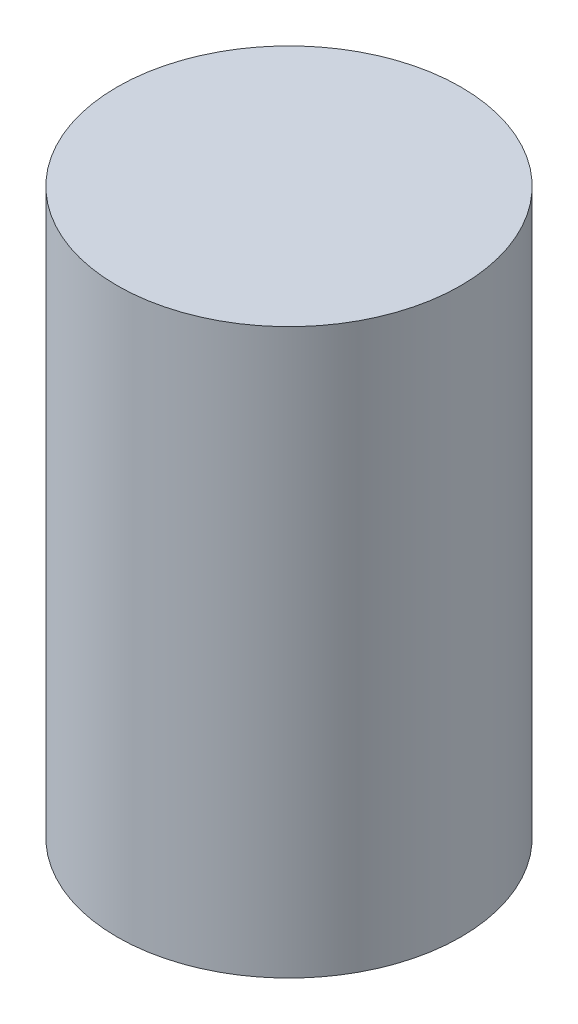
ISO-10303-21;
HEADER;
FILE_DESCRIPTION(('STEP AP214'),'2;1');
FILE_NAME('part.step','',(''),(''),'','','');
FILE_SCHEMA(('AUTOMOTIVE_DESIGN { 1 0 10303 214 1 1 1 1 }'));
ENDSEC;
DATA;
#1=APPLICATION_CONTEXT('core data for automotive mechanical design processes');
#2=APPLICATION_PROTOCOL_DEFINITION('international standard','automotive_design',2000,#1);
#3=PRODUCT_CONTEXT('',#1,'mechanical');
#4=PRODUCT('Part','Part','',(#3));
#5=PRODUCT_RELATED_PRODUCT_CATEGORY('part','',(#4));
#6=PRODUCT_DEFINITION_FORMATION('','',#4);
#7=PRODUCT_DEFINITION_CONTEXT('part definition',#1,'design');
#8=PRODUCT_DEFINITION('design','',#6,#7);
#9=PRODUCT_DEFINITION_SHAPE('','',#8);
#10=(LENGTH_UNIT() NAMED_UNIT(*) SI_UNIT(.MILLI.,.METRE.));
#11=(NAMED_UNIT(*) PLANE_ANGLE_UNIT() SI_UNIT($,.RADIAN.));
#12=(NAMED_UNIT(*) SI_UNIT($,.STERADIAN.) SOLID_ANGLE_UNIT());
#13=UNCERTAINTY_MEASURE_WITH_UNIT(LENGTH_MEASURE(1.E-05),#10,'distance_accuracy_value','');
#14=(GEOMETRIC_REPRESENTATION_CONTEXT(3) GLOBAL_UNCERTAINTY_ASSIGNED_CONTEXT((#13)) GLOBAL_UNIT_ASSIGNED_CONTEXT((#10,
#11,#12)) REPRESENTATION_CONTEXT('',''));
#15=CARTESIAN_POINT('',(0.,0.,0.));
#16=DIRECTION('',(0.,0.,1.));
#17=DIRECTION('',(1.,0.,0.));
#18=AXIS2_PLACEMENT_3D('',#15,#16,#17);
#19=CARTESIAN_POINT('',(0.,250.,0.));
#20=DIRECTION('',(0.,-1.,0.));
#21=DIRECTION('',(0.,0.,-1.));
#22=AXIS2_PLACEMENT_3D('',#19,#20,#21);
#23=CYLINDRICAL_SURFACE('',#22,76.2);
#24=CARTESIAN_POINT('',(0.,250.,0.));
#25=DIRECTION('',(0.,1.,0.));
#26=DIRECTION('',(0.,0.,1.));
#27=AXIS2_PLACEMENT_3D('',#24,#25,#26);
#28=CIRCLE('',#27,76.2);
#29=CARTESIAN_POINT('',(0.,250.,76.2));
#30=VERTEX_POINT('',#29);
#31=EDGE_CURVE('E10',#30,#30,#28,.T.);
#32=ORIENTED_EDGE('',*,*,#31,.F.);
#33=EDGE_LOOP('',(#32));
#34=FACE_BOUND('',#33,.T.);
#35=CARTESIAN_POINT('',(0.,0.,0.));
#36=DIRECTION('',(0.,1.,0.));
#37=DIRECTION('',(0.,0.,1.));
#38=AXIS2_PLACEMENT_3D('',#35,#36,#37);
#39=CIRCLE('',#38,76.2);
#40=CARTESIAN_POINT('',(0.,0.,76.2));
#41=VERTEX_POINT('',#40);
#42=EDGE_CURVE('E42',#41,#41,#39,.T.);
#43=ORIENTED_EDGE('',*,*,#42,.T.);
#44=EDGE_LOOP('',(#43));
#45=FACE_BOUND('',#44,.T.);
#46=ADVANCED_FACE('F39',(#34,#45),#23,.T.);
#47=CARTESIAN_POINT('',(0.,250.,0.));
#48=DIRECTION('',(0.,1.,0.));
#49=DIRECTION('',(0.,0.,1.));
#50=AXIS2_PLACEMENT_3D('',#47,#48,#49);
#51=PLANE('',#50);
#52=ORIENTED_EDGE('',*,*,#31,.T.);
#53=EDGE_LOOP('',(#52));
#54=FACE_BOUND('',#53,.T.);
#55=ADVANCED_FACE('F54',(#54),#51,.T.);
#56=CARTESIAN_POINT('',(0.,0.,0.));
#57=DIRECTION('',(0.,1.,0.));
#58=DIRECTION('',(0.,0.,1.));
#59=AXIS2_PLACEMENT_3D('',#56,#57,#58);
#60=PLANE('',#59);
#61=ORIENTED_EDGE('',*,*,#42,.F.);
#62=EDGE_LOOP('',(#61));
#63=FACE_BOUND('',#62,.T.);
#64=ADVANCED_FACE('F52',(#63),#60,.F.);
#65=CLOSED_SHELL('',(#46,#55,#64));
#66=MANIFOLD_SOLID_BREP('B2',#65);
#67=ADVANCED_BREP_SHAPE_REPRESENTATION('',(#18,#66),#14);
#68=SHAPE_DEFINITION_REPRESENTATION(#9,#67);
ENDSEC;
END-ISO-10303-21;
